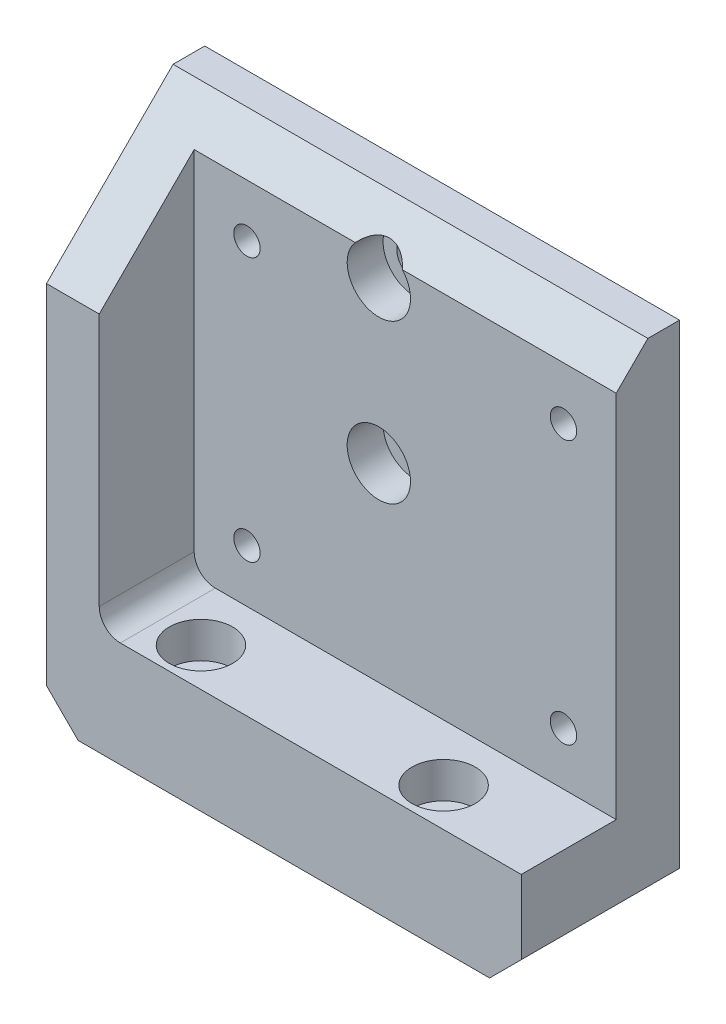
ISO-10303-21;
HEADER;
FILE_DESCRIPTION(('STEP AP214'),'2;1');
FILE_NAME('part.step','',(''),(''),'','','');
FILE_SCHEMA(('AUTOMOTIVE_DESIGN { 1 0 10303 214 1 1 1 1 }'));
ENDSEC;
DATA;
#1=APPLICATION_CONTEXT('core data for automotive mechanical design processes');
#2=APPLICATION_PROTOCOL_DEFINITION('international standard','automotive_design',2000,#1);
#3=PRODUCT_CONTEXT('',#1,'mechanical');
#4=PRODUCT('Part','Part','',(#3));
#5=PRODUCT_RELATED_PRODUCT_CATEGORY('part','',(#4));
#6=PRODUCT_DEFINITION_FORMATION('','',#4);
#7=PRODUCT_DEFINITION_CONTEXT('part definition',#1,'design');
#8=PRODUCT_DEFINITION('design','',#6,#7);
#9=PRODUCT_DEFINITION_SHAPE('','',#8);
#10=(LENGTH_UNIT() NAMED_UNIT(*) SI_UNIT(.MILLI.,.METRE.));
#11=(NAMED_UNIT(*) PLANE_ANGLE_UNIT() SI_UNIT($,.RADIAN.));
#12=(NAMED_UNIT(*) SI_UNIT($,.STERADIAN.) SOLID_ANGLE_UNIT());
#13=UNCERTAINTY_MEASURE_WITH_UNIT(LENGTH_MEASURE(1.E-05),#10,'distance_accuracy_value','');
#14=(GEOMETRIC_REPRESENTATION_CONTEXT(3) GLOBAL_UNCERTAINTY_ASSIGNED_CONTEXT((#13)) GLOBAL_UNIT_ASSIGNED_CONTEXT((#10,
#11,#12)) REPRESENTATION_CONTEXT('',''));
#15=CARTESIAN_POINT('',(0.,0.,0.));
#16=DIRECTION('',(0.,0.,1.));
#17=DIRECTION('',(1.,0.,0.));
#18=AXIS2_PLACEMENT_3D('',#15,#16,#17);
#19=CARTESIAN_POINT('',(-22.5,24.,6.));
#20=DIRECTION('',(0.,-1.,0.));
#21=DIRECTION('',(0.,0.,-1.));
#22=AXIS2_PLACEMENT_3D('',#19,#20,#21);
#23=PLANE('',#22);
#24=DIRECTION('',(-1.,0.,0.));
#25=VECTOR('',#24,1.);
#26=CARTESIAN_POINT('',(156.854164094015,24.,3.));
#27=LINE('',#26,#25);
#28=CARTESIAN_POINT('',(22.5,24.,3.));
#29=VERTEX_POINT('',#28);
#30=CARTESIAN_POINT('',(-22.5,24.,3.));
#31=VERTEX_POINT('',#30);
#32=EDGE_CURVE('E190',#29,#31,#27,.T.);
#33=ORIENTED_EDGE('',*,*,#32,.F.);
#34=DIRECTION('',(0.,0.,-1.));
#35=VECTOR('',#34,1.);
#36=CARTESIAN_POINT('',(22.5,24.,6.));
#37=LINE('',#36,#35);
#38=CARTESIAN_POINT('',(22.5,24.,0.));
#39=VERTEX_POINT('',#38);
#40=EDGE_CURVE('E320',#29,#39,#37,.T.);
#41=ORIENTED_EDGE('',*,*,#40,.T.);
#42=DIRECTION('',(-1.,0.,0.));
#43=VECTOR('',#42,1.);
#44=CARTESIAN_POINT('',(-22.5,24.,0.));
#45=LINE('',#44,#43);
#46=CARTESIAN_POINT('',(-22.5,24.,0.));
#47=VERTEX_POINT('',#46);
#48=EDGE_CURVE('E307',#39,#47,#45,.T.);
#49=ORIENTED_EDGE('',*,*,#48,.T.);
#50=DIRECTION('',(0.,0.,-1.));
#51=VECTOR('',#50,1.);
#52=CARTESIAN_POINT('',(-22.5,24.,6.));
#53=LINE('',#52,#51);
#54=EDGE_CURVE('E302',#31,#47,#53,.T.);
#55=ORIENTED_EDGE('',*,*,#54,.F.);
#56=EDGE_LOOP('',(#33,#41,#49,#55));
#57=FACE_BOUND('',#56,.T.);
#58=ADVANCED_FACE('F48',(#57),#23,.F.);
#59=CARTESIAN_POINT('',(22.5,-14.,15.));
#60=DIRECTION('',(0.,0.,1.));
#61=DIRECTION('',(1.,0.,0.));
#62=AXIS2_PLACEMENT_3D('',#59,#60,#61);
#63=PLANE('',#62);
#64=DIRECTION('',(0.,1.,0.));
#65=VECTOR('',#64,1.);
#66=CARTESIAN_POINT('',(-17.5,24.,15.));
#67=LINE('',#66,#65);
#68=CARTESIAN_POINT('',(-17.5,-12.,15.));
#69=VERTEX_POINT('',#68);
#70=CARTESIAN_POINT('',(-17.5,12.0000000000001,15.));
#71=VERTEX_POINT('',#70);
#72=EDGE_CURVE('E247',#69,#71,#67,.T.);
#73=ORIENTED_EDGE('',*,*,#72,.T.);
#74=DIRECTION('',(-1.,0.,0.));
#75=VECTOR('',#74,1.);
#76=CARTESIAN_POINT('',(156.854164094015,12.0000000000001,15.));
#77=LINE('',#76,#75);
#78=CARTESIAN_POINT('',(-22.5,12.0000000000001,15.));
#79=VERTEX_POINT('',#78);
#80=EDGE_CURVE('E191',#71,#79,#77,.T.);
#81=ORIENTED_EDGE('',*,*,#80,.T.);
#82=DIRECTION('',(0.,-1.,0.));
#83=VECTOR('',#82,1.);
#84=CARTESIAN_POINT('',(-22.5,-14.,15.));
#85=LINE('',#84,#83);
#86=CARTESIAN_POINT('',(-22.5,-21.,15.));
#87=VERTEX_POINT('',#86);
#88=EDGE_CURVE('E72',#79,#87,#85,.T.);
#89=ORIENTED_EDGE('',*,*,#88,.T.);
#90=DIRECTION('',(-0.707106781186546,0.707106781186549,0.));
#91=VECTOR('',#90,1.);
#92=CARTESIAN_POINT('',(-3.5000000000001,-40.,15.));
#93=LINE('',#92,#91);
#94=CARTESIAN_POINT('',(-19.5,-24.,15.));
#95=VERTEX_POINT('',#94);
#96=EDGE_CURVE('E359',#87,#95,#93,.F.);
#97=ORIENTED_EDGE('',*,*,#96,.T.);
#98=DIRECTION('',(-1.,0.,0.));
#99=VECTOR('',#98,1.);
#100=CARTESIAN_POINT('',(22.5,-24.,15.));
#101=LINE('',#100,#99);
#102=CARTESIAN_POINT('',(19.5,-24.,15.));
#103=VERTEX_POINT('',#102);
#104=EDGE_CURVE('E281',#103,#95,#101,.T.);
#105=ORIENTED_EDGE('',*,*,#104,.F.);
#106=DIRECTION('',(-0.707106781186548,-0.707106781186547,0.));
#107=VECTOR('',#106,1.);
#108=CARTESIAN_POINT('',(26.,-17.5,15.));
#109=LINE('',#108,#107);
#110=CARTESIAN_POINT('',(22.5,-21.,15.));
#111=VERTEX_POINT('',#110);
#112=EDGE_CURVE('E362',#103,#111,#109,.F.);
#113=ORIENTED_EDGE('',*,*,#112,.T.);
#114=DIRECTION('',(0.,-1.,0.));
#115=VECTOR('',#114,1.);
#116=CARTESIAN_POINT('',(22.5,-14.,15.));
#117=LINE('',#116,#115);
#118=CARTESIAN_POINT('',(22.5,-14.,15.));
#119=VERTEX_POINT('',#118);
#120=EDGE_CURVE('E285',#119,#111,#117,.T.);
#121=ORIENTED_EDGE('',*,*,#120,.F.);
#122=DIRECTION('',(-1.,0.,0.));
#123=VECTOR('',#122,1.);
#124=CARTESIAN_POINT('',(22.5,-14.,15.));
#125=LINE('',#124,#123);
#126=CARTESIAN_POINT('',(-15.5,-14.,15.));
#127=VERTEX_POINT('',#126);
#128=EDGE_CURVE('E280',#119,#127,#125,.T.);
#129=ORIENTED_EDGE('',*,*,#128,.T.);
#130=CARTESIAN_POINT('',(-15.5,-12.,15.));
#131=DIRECTION('',(0.,0.,1.));
#132=DIRECTION('',(1.,0.,0.));
#133=AXIS2_PLACEMENT_3D('',#130,#131,#132);
#134=CIRCLE('',#133,2.);
#135=EDGE_CURVE('E339',#127,#69,#134,.F.);
#136=ORIENTED_EDGE('',*,*,#135,.T.);
#137=EDGE_LOOP('',(#73,#81,#89,#97,#105,#113,#121,#129,#136));
#138=FACE_BOUND('',#137,.T.);
#139=ADVANCED_FACE('F373',(#138),#63,.T.);
#140=CARTESIAN_POINT('',(0.,0.,6.));
#141=DIRECTION('',(0.,0.,1.));
#142=DIRECTION('',(1.,0.,0.));
#143=AXIS2_PLACEMENT_3D('',#140,#141,#142);
#144=PLANE('',#143);
#145=CARTESIAN_POINT('',(-12.5,16.,6.));
#146=DIRECTION('',(0.,0.,1.));
#147=DIRECTION('',(1.,0.,0.));
#148=AXIS2_PLACEMENT_3D('',#145,#146,#147);
#149=CIRCLE('',#148,1.25);
#150=CARTESIAN_POINT('',(-11.25,16.,6.));
#151=VERTEX_POINT('',#150);
#152=EDGE_CURVE('E161',#151,#151,#149,.T.);
#153=ORIENTED_EDGE('',*,*,#152,.F.);
#154=EDGE_LOOP('',(#153));
#155=FACE_BOUND('',#154,.T.);
#156=CARTESIAN_POINT('',(17.5,16.,6.));
#157=DIRECTION('',(0.,0.,1.));
#158=DIRECTION('',(1.,0.,0.));
#159=AXIS2_PLACEMENT_3D('',#156,#157,#158);
#160=CIRCLE('',#159,1.25);
#161=CARTESIAN_POINT('',(18.75,16.,6.));
#162=VERTEX_POINT('',#161);
#163=EDGE_CURVE('E160',#162,#162,#160,.T.);
#164=ORIENTED_EDGE('',*,*,#163,.F.);
#165=EDGE_LOOP('',(#164));
#166=FACE_BOUND('',#165,.T.);
#167=CARTESIAN_POINT('',(-12.5,-9.,6.));
#168=DIRECTION('',(0.,0.,1.));
#169=DIRECTION('',(1.,0.,0.));
#170=AXIS2_PLACEMENT_3D('',#167,#168,#169);
#171=CIRCLE('',#170,1.25);
#172=CARTESIAN_POINT('',(-11.25,-9.,6.));
#173=VERTEX_POINT('',#172);
#174=EDGE_CURVE('E174',#173,#173,#171,.T.);
#175=ORIENTED_EDGE('',*,*,#174,.F.);
#176=EDGE_LOOP('',(#175));
#177=FACE_BOUND('',#176,.T.);
#178=CARTESIAN_POINT('',(17.5,-9.,6.));
#179=DIRECTION('',(0.,0.,1.));
#180=DIRECTION('',(1.,0.,0.));
#181=AXIS2_PLACEMENT_3D('',#178,#179,#180);
#182=CIRCLE('',#181,1.25);
#183=CARTESIAN_POINT('',(18.75,-9.,6.));
#184=VERTEX_POINT('',#183);
#185=EDGE_CURVE('E182',#184,#184,#182,.T.);
#186=ORIENTED_EDGE('',*,*,#185,.F.);
#187=EDGE_LOOP('',(#186));
#188=FACE_BOUND('',#187,.T.);
#189=DIRECTION('',(1.,0.,0.));
#190=VECTOR('',#189,1.);
#191=CARTESIAN_POINT('',(0.,21.,6.));
#192=LINE('',#191,#190);
#193=CARTESIAN_POINT('',(-17.5,21.,6.));
#194=VERTEX_POINT('',#193);
#195=CARTESIAN_POINT('',(-2.23606797749977,21.,6.));
#196=VERTEX_POINT('',#195);
#197=EDGE_CURVE('E65',#194,#196,#192,.T.);
#198=ORIENTED_EDGE('',*,*,#197,.F.);
#199=DIRECTION('',(0.,1.,0.));
#200=VECTOR('',#199,1.);
#201=CARTESIAN_POINT('',(-17.5,24.,6.));
#202=LINE('',#201,#200);
#203=CARTESIAN_POINT('',(-17.5,-12.,6.));
#204=VERTEX_POINT('',#203);
#205=EDGE_CURVE('E243',#204,#194,#202,.T.);
#206=ORIENTED_EDGE('',*,*,#205,.F.);
#207=CARTESIAN_POINT('',(-15.5,-12.,6.));
#208=DIRECTION('',(0.,0.,1.));
#209=DIRECTION('',(1.,0.,0.));
#210=AXIS2_PLACEMENT_3D('',#207,#208,#209);
#211=CIRCLE('',#210,2.);
#212=CARTESIAN_POINT('',(-15.5,-14.,6.));
#213=VERTEX_POINT('',#212);
#214=EDGE_CURVE('E333',#204,#213,#211,.T.);
#215=ORIENTED_EDGE('',*,*,#214,.T.);
#216=DIRECTION('',(1.,0.,0.));
#217=VECTOR('',#216,1.);
#218=CARTESIAN_POINT('',(0.,-14.,6.));
#219=LINE('',#218,#217);
#220=CARTESIAN_POINT('',(22.5,-14.,6.));
#221=VERTEX_POINT('',#220);
#222=EDGE_CURVE('E291',#213,#221,#219,.T.);
#223=ORIENTED_EDGE('',*,*,#222,.T.);
#224=DIRECTION('',(0.,1.,0.));
#225=VECTOR('',#224,1.);
#226=CARTESIAN_POINT('',(22.5,24.,6.));
#227=LINE('',#226,#225);
#228=CARTESIAN_POINT('',(22.5,21.,6.));
#229=VERTEX_POINT('',#228);
#230=EDGE_CURVE('E298',#221,#229,#227,.T.);
#231=ORIENTED_EDGE('',*,*,#230,.T.);
#232=CARTESIAN_POINT('',(2.23606797749976,21.,6.));
#233=VERTEX_POINT('',#232);
#234=EDGE_CURVE('E194',#233,#229,#192,.T.);
#235=ORIENTED_EDGE('',*,*,#234,.F.);
#236=CARTESIAN_POINT('',(0.,19.,6.));
#237=DIRECTION('',(0.,0.,1.));
#238=DIRECTION('',(1.,0.,0.));
#239=AXIS2_PLACEMENT_3D('',#236,#237,#238);
#240=CIRCLE('',#239,3.);
#241=EDGE_CURVE('E211',#196,#233,#240,.T.);
#242=ORIENTED_EDGE('',*,*,#241,.F.);
#243=EDGE_LOOP('',(#198,#206,#215,#223,#231,#235,#242));
#244=FACE_BOUND('',#243,.T.);
#245=CARTESIAN_POINT('',(0.,4.,6.));
#246=DIRECTION('',(0.,0.,1.));
#247=DIRECTION('',(1.,0.,0.));
#248=AXIS2_PLACEMENT_3D('',#245,#246,#247);
#249=CIRCLE('',#248,3.);
#250=CARTESIAN_POINT('',(3.,4.,6.));
#251=VERTEX_POINT('',#250);
#252=EDGE_CURVE('E227',#251,#251,#249,.T.);
#253=ORIENTED_EDGE('',*,*,#252,.F.);
#254=EDGE_LOOP('',(#253));
#255=FACE_BOUND('',#254,.T.);
#256=ADVANCED_FACE('F403',(#155,#166,#177,#188,#244,#255),#144,.T.);
#257=CARTESIAN_POINT('',(0.,-14.,0.));
#258=DIRECTION('',(0.,-1.,0.));
#259=DIRECTION('',(0.,0.,-1.));
#260=AXIS2_PLACEMENT_3D('',#257,#258,#259);
#261=PLANE('',#260);
#262=CARTESIAN_POINT('',(11.5,-14.,11.36));
#263=DIRECTION('',(0.,1.,0.));
#264=DIRECTION('',(0.,0.,1.));
#265=AXIS2_PLACEMENT_3D('',#262,#263,#264);
#266=CIRCLE('',#265,3.);
#267=CARTESIAN_POINT('',(11.5,-14.,14.36));
#268=VERTEX_POINT('',#267);
#269=EDGE_CURVE('E264',#268,#268,#266,.T.);
#270=ORIENTED_EDGE('',*,*,#269,.F.);
#271=EDGE_LOOP('',(#270));
#272=FACE_BOUND('',#271,.T.);
#273=CARTESIAN_POINT('',(-11.5,-14.,11.36));
#274=DIRECTION('',(0.,1.,0.));
#275=DIRECTION('',(0.,0.,1.));
#276=AXIS2_PLACEMENT_3D('',#273,#274,#275);
#277=CIRCLE('',#276,3.);
#278=CARTESIAN_POINT('',(-11.5,-14.,14.36));
#279=VERTEX_POINT('',#278);
#280=EDGE_CURVE('E251',#279,#279,#277,.T.);
#281=ORIENTED_EDGE('',*,*,#280,.F.);
#282=EDGE_LOOP('',(#281));
#283=FACE_BOUND('',#282,.T.);
#284=ORIENTED_EDGE('',*,*,#222,.F.);
#285=DIRECTION('',(0.,0.,-1.));
#286=VECTOR('',#285,1.);
#287=CARTESIAN_POINT('',(-15.5,-14.,15.));
#288=LINE('',#287,#286);
#289=EDGE_CURVE('E336',#213,#127,#288,.F.);
#290=ORIENTED_EDGE('',*,*,#289,.T.);
#291=ORIENTED_EDGE('',*,*,#128,.F.);
#292=DIRECTION('',(0.,0.,1.));
#293=VECTOR('',#292,1.);
#294=CARTESIAN_POINT('',(22.5,-14.,0.));
#295=LINE('',#294,#293);
#296=EDGE_CURVE('E277',#221,#119,#295,.T.);
#297=ORIENTED_EDGE('',*,*,#296,.F.);
#298=EDGE_LOOP('',(#284,#290,#291,#297));
#299=FACE_BOUND('',#298,.T.);
#300=ADVANCED_FACE('F392',(#272,#283,#299),#261,.F.);
#301=CARTESIAN_POINT('',(22.5,24.,6.));
#302=DIRECTION('',(-1.,0.,0.));
#303=DIRECTION('',(0.,-1.,0.));
#304=AXIS2_PLACEMENT_3D('',#301,#302,#303);
#305=PLANE('',#304);
#306=ORIENTED_EDGE('',*,*,#40,.F.);
#307=DIRECTION('',(0.,-0.707106781186544,0.707106781186551));
#308=VECTOR('',#307,1.);
#309=CARTESIAN_POINT('',(22.5,22.5,4.50000000000001));
#310=LINE('',#309,#308);
#311=EDGE_CURVE('E203',#29,#229,#310,.T.);
#312=ORIENTED_EDGE('',*,*,#311,.T.);
#313=ORIENTED_EDGE('',*,*,#230,.F.);
#314=ORIENTED_EDGE('',*,*,#296,.T.);
#315=ORIENTED_EDGE('',*,*,#120,.T.);
#316=DIRECTION('',(0.,0.,-1.));
#317=VECTOR('',#316,1.);
#318=CARTESIAN_POINT('',(22.5,-21.,6.));
#319=LINE('',#318,#317);
#320=CARTESIAN_POINT('',(22.5,-21.,0.));
#321=VERTEX_POINT('',#320);
#322=EDGE_CURVE('E342',#111,#321,#319,.T.);
#323=ORIENTED_EDGE('',*,*,#322,.T.);
#324=DIRECTION('',(0.,1.,0.));
#325=VECTOR('',#324,1.);
#326=CARTESIAN_POINT('',(22.5,24.,0.));
#327=LINE('',#326,#325);
#328=EDGE_CURVE('E297',#321,#39,#327,.T.);
#329=ORIENTED_EDGE('',*,*,#328,.T.);
#330=EDGE_LOOP('',(#306,#312,#313,#314,#315,#323,#329));
#331=FACE_BOUND('',#330,.T.);
#332=ADVANCED_FACE('F386',(#331),#305,.F.);
#333=CARTESIAN_POINT('',(-22.5,24.,6.));
#334=DIRECTION('',(1.,0.,0.));
#335=DIRECTION('',(0.,1.,0.));
#336=AXIS2_PLACEMENT_3D('',#333,#334,#335);
#337=PLANE('',#336);
#338=ORIENTED_EDGE('',*,*,#88,.F.);
#339=DIRECTION('',(0.,0.707106781186544,-0.707106781186551));
#340=VECTOR('',#339,1.);
#341=CARTESIAN_POINT('',(-22.5,22.5,4.50000000000001));
#342=LINE('',#341,#340);
#343=EDGE_CURVE('E207',#79,#31,#342,.T.);
#344=ORIENTED_EDGE('',*,*,#343,.T.);
#345=ORIENTED_EDGE('',*,*,#54,.T.);
#346=DIRECTION('',(0.,-1.,0.));
#347=VECTOR('',#346,1.);
#348=CARTESIAN_POINT('',(-22.5,24.,0.));
#349=LINE('',#348,#347);
#350=CARTESIAN_POINT('',(-22.5,-21.,0.));
#351=VERTEX_POINT('',#350);
#352=EDGE_CURVE('E311',#47,#351,#349,.T.);
#353=ORIENTED_EDGE('',*,*,#352,.T.);
#354=DIRECTION('',(0.,0.,1.));
#355=VECTOR('',#354,1.);
#356=CARTESIAN_POINT('',(-22.5,-21.,6.));
#357=LINE('',#356,#355);
#358=EDGE_CURVE('E58',#351,#87,#357,.T.);
#359=ORIENTED_EDGE('',*,*,#358,.T.);
#360=EDGE_LOOP('',(#338,#344,#345,#353,#359));
#361=FACE_BOUND('',#360,.T.);
#362=ADVANCED_FACE('F368',(#361),#337,.F.);
#363=CARTESIAN_POINT('',(-22.5,-24.,6.));
#364=DIRECTION('',(0.,1.,0.));
#365=DIRECTION('',(0.,0.,1.));
#366=AXIS2_PLACEMENT_3D('',#363,#364,#365);
#367=PLANE('',#366);
#368=CARTESIAN_POINT('',(-11.5,-24.,11.36));
#369=DIRECTION('',(0.,1.,0.));
#370=DIRECTION('',(0.,0.,1.));
#371=AXIS2_PLACEMENT_3D('',#368,#369,#370);
#372=CIRCLE('',#371,1.7);
#373=CARTESIAN_POINT('',(-11.5,-24.,13.06));
#374=VERTEX_POINT('',#373);
#375=EDGE_CURVE('E263',#374,#374,#372,.T.);
#376=ORIENTED_EDGE('',*,*,#375,.T.);
#377=EDGE_LOOP('',(#376));
#378=FACE_BOUND('',#377,.T.);
#379=CARTESIAN_POINT('',(11.5,-24.,11.36));
#380=DIRECTION('',(0.,1.,0.));
#381=DIRECTION('',(0.,0.,1.));
#382=AXIS2_PLACEMENT_3D('',#379,#380,#381);
#383=CIRCLE('',#382,1.7);
#384=CARTESIAN_POINT('',(11.5,-24.,13.06));
#385=VERTEX_POINT('',#384);
#386=EDGE_CURVE('E276',#385,#385,#383,.T.);
#387=ORIENTED_EDGE('',*,*,#386,.T.);
#388=EDGE_LOOP('',(#387));
#389=FACE_BOUND('',#388,.T.);
#390=DIRECTION('',(1.,0.,0.));
#391=VECTOR('',#390,1.);
#392=CARTESIAN_POINT('',(-22.5,-24.,0.));
#393=LINE('',#392,#391);
#394=CARTESIAN_POINT('',(-19.5,-24.,0.));
#395=VERTEX_POINT('',#394);
#396=CARTESIAN_POINT('',(19.5,-24.,0.));
#397=VERTEX_POINT('',#396);
#398=EDGE_CURVE('E303',#395,#397,#393,.T.);
#399=ORIENTED_EDGE('',*,*,#398,.T.);
#400=DIRECTION('',(0.,0.,1.));
#401=VECTOR('',#400,1.);
#402=CARTESIAN_POINT('',(19.5,-24.,6.));
#403=LINE('',#402,#401);
#404=EDGE_CURVE('E356',#397,#103,#403,.T.);
#405=ORIENTED_EDGE('',*,*,#404,.T.);
#406=ORIENTED_EDGE('',*,*,#104,.T.);
#407=DIRECTION('',(0.,0.,-1.));
#408=VECTOR('',#407,1.);
#409=CARTESIAN_POINT('',(-19.5,-24.,6.));
#410=LINE('',#409,#408);
#411=EDGE_CURVE('E352',#95,#395,#410,.T.);
#412=ORIENTED_EDGE('',*,*,#411,.T.);
#413=EDGE_LOOP('',(#399,#405,#406,#412));
#414=FACE_BOUND('',#413,.T.);
#415=ADVANCED_FACE('F376',(#378,#389,#414),#367,.F.);
#416=CARTESIAN_POINT('',(0.,0.,0.));
#417=DIRECTION('',(0.,0.,1.));
#418=DIRECTION('',(1.,0.,0.));
#419=AXIS2_PLACEMENT_3D('',#416,#417,#418);
#420=PLANE('',#419);
#421=CARTESIAN_POINT('',(0.,19.,0.));
#422=DIRECTION('',(0.,0.,1.));
#423=DIRECTION('',(1.,0.,0.));
#424=AXIS2_PLACEMENT_3D('',#421,#422,#423);
#425=CIRCLE('',#424,1.7);
#426=CARTESIAN_POINT('',(1.7,19.,0.));
#427=VERTEX_POINT('',#426);
#428=EDGE_CURVE('E223',#427,#427,#425,.T.);
#429=ORIENTED_EDGE('',*,*,#428,.T.);
#430=EDGE_LOOP('',(#429));
#431=FACE_BOUND('',#430,.T.);
#432=CARTESIAN_POINT('',(0.,4.,0.));
#433=DIRECTION('',(0.,0.,1.));
#434=DIRECTION('',(1.,0.,0.));
#435=AXIS2_PLACEMENT_3D('',#432,#433,#434);
#436=CIRCLE('',#435,1.7);
#437=CARTESIAN_POINT('',(1.7,4.,0.));
#438=VERTEX_POINT('',#437);
#439=EDGE_CURVE('E239',#438,#438,#436,.T.);
#440=ORIENTED_EDGE('',*,*,#439,.T.);
#441=EDGE_LOOP('',(#440));
#442=FACE_BOUND('',#441,.T.);
#443=ORIENTED_EDGE('',*,*,#328,.F.);
#444=DIRECTION('',(0.707106781186548,0.707106781186547,0.));
#445=VECTOR('',#444,1.);
#446=CARTESIAN_POINT('',(22.5,-21.,0.));
#447=LINE('',#446,#445);
#448=EDGE_CURVE('E349',#321,#397,#447,.F.);
#449=ORIENTED_EDGE('',*,*,#448,.T.);
#450=ORIENTED_EDGE('',*,*,#398,.F.);
#451=DIRECTION('',(0.707106781186546,-0.707106781186549,0.));
#452=VECTOR('',#451,1.);
#453=CARTESIAN_POINT('',(-19.5,-24.,0.));
#454=LINE('',#453,#452);
#455=EDGE_CURVE('E346',#395,#351,#454,.F.);
#456=ORIENTED_EDGE('',*,*,#455,.T.);
#457=ORIENTED_EDGE('',*,*,#352,.F.);
#458=ORIENTED_EDGE('',*,*,#48,.F.);
#459=EDGE_LOOP('',(#443,#449,#450,#456,#457,#458));
#460=FACE_BOUND('',#459,.T.);
#461=ADVANCED_FACE('F416',(#431,#442,#460),#420,.F.);
#462=CARTESIAN_POINT('',(11.5,-14.,11.36));
#463=DIRECTION('',(0.,1.,0.));
#464=DIRECTION('',(0.,0.,1.));
#465=AXIS2_PLACEMENT_3D('',#462,#463,#464);
#466=CYLINDRICAL_SURFACE('',#465,1.7);
#467=CARTESIAN_POINT('',(11.5,-17.4,11.36));
#468=DIRECTION('',(0.,1.,0.));
#469=DIRECTION('',(0.,0.,1.));
#470=AXIS2_PLACEMENT_3D('',#467,#468,#469);
#471=CIRCLE('',#470,1.7);
#472=CARTESIAN_POINT('',(11.5,-17.4,13.06));
#473=VERTEX_POINT('',#472);
#474=EDGE_CURVE('E272',#473,#473,#471,.T.);
#475=ORIENTED_EDGE('',*,*,#474,.T.);
#476=EDGE_LOOP('',(#475));
#477=FACE_BOUND('',#476,.T.);
#478=ORIENTED_EDGE('',*,*,#386,.F.);
#479=EDGE_LOOP('',(#478));
#480=FACE_BOUND('',#479,.T.);
#481=ADVANCED_FACE('F418',(#477,#480),#466,.F.);
#482=CARTESIAN_POINT('',(13.2,-17.4,11.36));
#483=DIRECTION('',(0.,-1.,0.));
#484=DIRECTION('',(0.,0.,-1.));
#485=AXIS2_PLACEMENT_3D('',#482,#483,#484);
#486=PLANE('',#485);
#487=ORIENTED_EDGE('',*,*,#474,.F.);
#488=EDGE_LOOP('',(#487));
#489=FACE_BOUND('',#488,.T.);
#490=CARTESIAN_POINT('',(11.5,-17.4,11.36));
#491=DIRECTION('',(0.,1.,0.));
#492=DIRECTION('',(0.,0.,1.));
#493=AXIS2_PLACEMENT_3D('',#490,#491,#492);
#494=CIRCLE('',#493,3.);
#495=CARTESIAN_POINT('',(11.5,-17.4,14.36));
#496=VERTEX_POINT('',#495);
#497=EDGE_CURVE('E268',#496,#496,#494,.T.);
#498=ORIENTED_EDGE('',*,*,#497,.T.);
#499=EDGE_LOOP('',(#498));
#500=FACE_BOUND('',#499,.T.);
#501=ADVANCED_FACE('F425',(#489,#500),#486,.F.);
#502=CARTESIAN_POINT('',(11.5,-14.,11.36));
#503=DIRECTION('',(0.,1.,0.));
#504=DIRECTION('',(0.,0.,1.));
#505=AXIS2_PLACEMENT_3D('',#502,#503,#504);
#506=CYLINDRICAL_SURFACE('',#505,3.);
#507=ORIENTED_EDGE('',*,*,#497,.F.);
#508=EDGE_LOOP('',(#507));
#509=FACE_BOUND('',#508,.T.);
#510=ORIENTED_EDGE('',*,*,#269,.T.);
#511=EDGE_LOOP('',(#510));
#512=FACE_BOUND('',#511,.T.);
#513=ADVANCED_FACE('F492',(#509,#512),#506,.F.);
#514=CARTESIAN_POINT('',(-11.5,-14.,11.36));
#515=DIRECTION('',(0.,1.,0.));
#516=DIRECTION('',(0.,0.,1.));
#517=AXIS2_PLACEMENT_3D('',#514,#515,#516);
#518=CYLINDRICAL_SURFACE('',#517,1.7);
#519=CARTESIAN_POINT('',(-11.5,-17.4,11.36));
#520=DIRECTION('',(0.,1.,0.));
#521=DIRECTION('',(0.,0.,1.));
#522=AXIS2_PLACEMENT_3D('',#519,#520,#521);
#523=CIRCLE('',#522,1.7);
#524=CARTESIAN_POINT('',(-11.5,-17.4,13.06));
#525=VERTEX_POINT('',#524);
#526=EDGE_CURVE('E259',#525,#525,#523,.T.);
#527=ORIENTED_EDGE('',*,*,#526,.T.);
#528=EDGE_LOOP('',(#527));
#529=FACE_BOUND('',#528,.T.);
#530=ORIENTED_EDGE('',*,*,#375,.F.);
#531=EDGE_LOOP('',(#530));
#532=FACE_BOUND('',#531,.T.);
#533=ADVANCED_FACE('F488',(#529,#532),#518,.F.);
#534=CARTESIAN_POINT('',(-9.8,-17.4,11.36));
#535=DIRECTION('',(0.,-1.,0.));
#536=DIRECTION('',(0.,0.,-1.));
#537=AXIS2_PLACEMENT_3D('',#534,#535,#536);
#538=PLANE('',#537);
#539=ORIENTED_EDGE('',*,*,#526,.F.);
#540=EDGE_LOOP('',(#539));
#541=FACE_BOUND('',#540,.T.);
#542=CARTESIAN_POINT('',(-11.5,-17.4,11.36));
#543=DIRECTION('',(0.,1.,0.));
#544=DIRECTION('',(0.,0.,1.));
#545=AXIS2_PLACEMENT_3D('',#542,#543,#544);
#546=CIRCLE('',#545,3.);
#547=CARTESIAN_POINT('',(-11.5,-17.4,14.36));
#548=VERTEX_POINT('',#547);
#549=EDGE_CURVE('E255',#548,#548,#546,.T.);
#550=ORIENTED_EDGE('',*,*,#549,.T.);
#551=EDGE_LOOP('',(#550));
#552=FACE_BOUND('',#551,.T.);
#553=ADVANCED_FACE('F484',(#541,#552),#538,.F.);
#554=CARTESIAN_POINT('',(-11.5,-14.,11.36));
#555=DIRECTION('',(0.,1.,0.));
#556=DIRECTION('',(0.,0.,1.));
#557=AXIS2_PLACEMENT_3D('',#554,#555,#556);
#558=CYLINDRICAL_SURFACE('',#557,3.);
#559=ORIENTED_EDGE('',*,*,#549,.F.);
#560=EDGE_LOOP('',(#559));
#561=FACE_BOUND('',#560,.T.);
#562=ORIENTED_EDGE('',*,*,#280,.T.);
#563=EDGE_LOOP('',(#562));
#564=FACE_BOUND('',#563,.T.);
#565=ADVANCED_FACE('F481',(#561,#564),#558,.F.);
#566=CARTESIAN_POINT('',(-17.5,24.,53.3275357934736));
#567=DIRECTION('',(-1.,0.,0.));
#568=DIRECTION('',(0.,-1.,0.));
#569=AXIS2_PLACEMENT_3D('',#566,#567,#568);
#570=PLANE('',#569);
#571=ORIENTED_EDGE('',*,*,#205,.T.);
#572=DIRECTION('',(0.,-0.707106781186544,0.707106781186551));
#573=VECTOR('',#572,1.);
#574=CARTESIAN_POINT('',(-17.5,-1.1637678967368,28.1637678967371));
#575=LINE('',#574,#573);
#576=EDGE_CURVE('E199',#194,#71,#575,.T.);
#577=ORIENTED_EDGE('',*,*,#576,.T.);
#578=ORIENTED_EDGE('',*,*,#72,.F.);
#579=DIRECTION('',(0.,0.,-1.));
#580=VECTOR('',#579,1.);
#581=CARTESIAN_POINT('',(-17.5,-12.,6.));
#582=LINE('',#581,#580);
#583=EDGE_CURVE('E323',#69,#204,#582,.T.);
#584=ORIENTED_EDGE('',*,*,#583,.T.);
#585=EDGE_LOOP('',(#571,#577,#578,#584));
#586=FACE_BOUND('',#585,.T.);
#587=ADVANCED_FACE('F401',(#586),#570,.F.);
#588=CARTESIAN_POINT('',(-15.5,-12.,53.3275357934736));
#589=DIRECTION('',(0.,0.,1.));
#590=DIRECTION('',(1.,0.,0.));
#591=AXIS2_PLACEMENT_3D('',#588,#589,#590);
#592=CYLINDRICAL_SURFACE('',#591,2.);
#593=ORIENTED_EDGE('',*,*,#135,.F.);
#594=ORIENTED_EDGE('',*,*,#289,.F.);
#595=ORIENTED_EDGE('',*,*,#214,.F.);
#596=ORIENTED_EDGE('',*,*,#583,.F.);
#597=EDGE_LOOP('',(#593,#594,#595,#596));
#598=FACE_BOUND('',#597,.T.);
#599=ADVANCED_FACE('F398',(#598),#592,.F.);
#600=CARTESIAN_POINT('',(0.,4.,6.));
#601=DIRECTION('',(0.,0.,1.));
#602=DIRECTION('',(1.,0.,0.));
#603=AXIS2_PLACEMENT_3D('',#600,#601,#602);
#604=CYLINDRICAL_SURFACE('',#603,1.7);
#605=ORIENTED_EDGE('',*,*,#439,.F.);
#606=EDGE_LOOP('',(#605));
#607=FACE_BOUND('',#606,.T.);
#608=CARTESIAN_POINT('',(0.,4.,2.6));
#609=DIRECTION('',(0.,0.,1.));
#610=DIRECTION('',(1.,0.,0.));
#611=AXIS2_PLACEMENT_3D('',#608,#609,#610);
#612=CIRCLE('',#611,1.7);
#613=CARTESIAN_POINT('',(1.7,4.,2.6));
#614=VERTEX_POINT('',#613);
#615=EDGE_CURVE('E235',#614,#614,#612,.T.);
#616=ORIENTED_EDGE('',*,*,#615,.T.);
#617=EDGE_LOOP('',(#616));
#618=FACE_BOUND('',#617,.T.);
#619=ADVANCED_FACE('F443',(#607,#618),#604,.F.);
#620=CARTESIAN_POINT('',(1.7,4.,2.6));
#621=DIRECTION('',(0.,0.,-1.));
#622=DIRECTION('',(-1.,0.,0.));
#623=AXIS2_PLACEMENT_3D('',#620,#621,#622);
#624=PLANE('',#623);
#625=ORIENTED_EDGE('',*,*,#615,.F.);
#626=EDGE_LOOP('',(#625));
#627=FACE_BOUND('',#626,.T.);
#628=CARTESIAN_POINT('',(0.,4.,2.6));
#629=DIRECTION('',(0.,0.,1.));
#630=DIRECTION('',(1.,0.,0.));
#631=AXIS2_PLACEMENT_3D('',#628,#629,#630);
#632=CIRCLE('',#631,3.);
#633=CARTESIAN_POINT('',(3.,4.,2.6));
#634=VERTEX_POINT('',#633);
#635=EDGE_CURVE('E231',#634,#634,#632,.T.);
#636=ORIENTED_EDGE('',*,*,#635,.T.);
#637=EDGE_LOOP('',(#636));
#638=FACE_BOUND('',#637,.T.);
#639=ADVANCED_FACE('F471',(#627,#638),#624,.F.);
#640=CARTESIAN_POINT('',(0.,4.,6.));
#641=DIRECTION('',(0.,0.,1.));
#642=DIRECTION('',(1.,0.,0.));
#643=AXIS2_PLACEMENT_3D('',#640,#641,#642);
#644=CYLINDRICAL_SURFACE('',#643,3.);
#645=ORIENTED_EDGE('',*,*,#635,.F.);
#646=EDGE_LOOP('',(#645));
#647=FACE_BOUND('',#646,.T.);
#648=ORIENTED_EDGE('',*,*,#252,.T.);
#649=EDGE_LOOP('',(#648));
#650=FACE_BOUND('',#649,.T.);
#651=ADVANCED_FACE('F467',(#647,#650),#644,.F.);
#652=CARTESIAN_POINT('',(0.,19.,6.));
#653=DIRECTION('',(0.,0.,1.));
#654=DIRECTION('',(1.,0.,0.));
#655=AXIS2_PLACEMENT_3D('',#652,#653,#654);
#656=CYLINDRICAL_SURFACE('',#655,1.7);
#657=ORIENTED_EDGE('',*,*,#428,.F.);
#658=EDGE_LOOP('',(#657));
#659=FACE_BOUND('',#658,.T.);
#660=CARTESIAN_POINT('',(0.,19.,2.6));
#661=DIRECTION('',(0.,0.,1.));
#662=DIRECTION('',(1.,0.,0.));
#663=AXIS2_PLACEMENT_3D('',#660,#661,#662);
#664=CIRCLE('',#663,1.7);
#665=CARTESIAN_POINT('',(1.7,19.,2.6));
#666=VERTEX_POINT('',#665);
#667=EDGE_CURVE('E219',#666,#666,#664,.T.);
#668=ORIENTED_EDGE('',*,*,#667,.T.);
#669=EDGE_LOOP('',(#668));
#670=FACE_BOUND('',#669,.T.);
#671=ADVANCED_FACE('F458',(#659,#670),#656,.F.);
#672=CARTESIAN_POINT('',(1.7,19.,2.6));
#673=DIRECTION('',(0.,0.,-1.));
#674=DIRECTION('',(-1.,0.,0.));
#675=AXIS2_PLACEMENT_3D('',#672,#673,#674);
#676=PLANE('',#675);
#677=ORIENTED_EDGE('',*,*,#667,.F.);
#678=EDGE_LOOP('',(#677));
#679=FACE_BOUND('',#678,.T.);
#680=CARTESIAN_POINT('',(0.,19.,2.6));
#681=DIRECTION('',(0.,0.,1.));
#682=DIRECTION('',(1.,0.,0.));
#683=AXIS2_PLACEMENT_3D('',#680,#681,#682);
#684=CIRCLE('',#683,3.);
#685=CARTESIAN_POINT('',(3.,19.,2.6));
#686=VERTEX_POINT('',#685);
#687=EDGE_CURVE('E215',#686,#686,#684,.T.);
#688=ORIENTED_EDGE('',*,*,#687,.T.);
#689=EDGE_LOOP('',(#688));
#690=FACE_BOUND('',#689,.T.);
#691=ADVANCED_FACE('F452',(#679,#690),#676,.F.);
#692=CARTESIAN_POINT('',(0.,19.,6.));
#693=DIRECTION('',(0.,0.,1.));
#694=DIRECTION('',(1.,0.,0.));
#695=AXIS2_PLACEMENT_3D('',#692,#693,#694);
#696=CYLINDRICAL_SURFACE('',#695,3.);
#697=ORIENTED_EDGE('',*,*,#687,.F.);
#698=EDGE_LOOP('',(#697));
#699=FACE_BOUND('',#698,.T.);
#700=ORIENTED_EDGE('',*,*,#241,.T.);
#701=CARTESIAN_POINT('',(0.,19.,8.00000000000005));
#702=DIRECTION('',(0.,-0.707106781186551,-0.707106781186544));
#703=DIRECTION('',(0.,-0.707106781186544,0.707106781186551));
#704=AXIS2_PLACEMENT_3D('',#701,#702,#703);
#705=ELLIPSE('',#704,4.24264068711931,3.);
#706=EDGE_CURVE('E11',#233,#196,#705,.F.);
#707=ORIENTED_EDGE('',*,*,#706,.T.);
#708=EDGE_LOOP('',(#700,#707));
#709=FACE_BOUND('',#708,.T.);
#710=ADVANCED_FACE('F409',(#699,#709),#696,.F.);
#711=CARTESIAN_POINT('',(22.5,-21.,6.));
#712=DIRECTION('',(-0.707106781186547,0.707106781186548,0.));
#713=DIRECTION('',(0.,0.,-1.));
#714=AXIS2_PLACEMENT_3D('',#711,#712,#713);
#715=PLANE('',#714);
#716=ORIENTED_EDGE('',*,*,#112,.F.);
#717=ORIENTED_EDGE('',*,*,#404,.F.);
#718=ORIENTED_EDGE('',*,*,#448,.F.);
#719=ORIENTED_EDGE('',*,*,#322,.F.);
#720=EDGE_LOOP('',(#716,#717,#718,#719));
#721=FACE_BOUND('',#720,.T.);
#722=ADVANCED_FACE('F380',(#721),#715,.F.);
#723=CARTESIAN_POINT('',(-19.5,-24.,6.));
#724=DIRECTION('',(0.707106781186549,0.707106781186546,0.));
#725=DIRECTION('',(0.,0.,-1.));
#726=AXIS2_PLACEMENT_3D('',#723,#724,#725);
#727=PLANE('',#726);
#728=ORIENTED_EDGE('',*,*,#96,.F.);
#729=ORIENTED_EDGE('',*,*,#358,.F.);
#730=ORIENTED_EDGE('',*,*,#455,.F.);
#731=ORIENTED_EDGE('',*,*,#411,.F.);
#732=EDGE_LOOP('',(#728,#729,#730,#731));
#733=FACE_BOUND('',#732,.T.);
#734=ADVANCED_FACE('F51',(#733),#727,.F.);
#735=CARTESIAN_POINT('',(156.854164094015,24.,3.));
#736=DIRECTION('',(0.,-0.707106781186551,-0.707106781186544));
#737=DIRECTION('',(0.,0.707106781186544,-0.707106781186551));
#738=AXIS2_PLACEMENT_3D('',#735,#736,#737);
#739=PLANE('',#738);
#740=ORIENTED_EDGE('',*,*,#343,.F.);
#741=ORIENTED_EDGE('',*,*,#80,.F.);
#742=ORIENTED_EDGE('',*,*,#576,.F.);
#743=ORIENTED_EDGE('',*,*,#197,.T.);
#744=ORIENTED_EDGE('',*,*,#706,.F.);
#745=ORIENTED_EDGE('',*,*,#234,.T.);
#746=ORIENTED_EDGE('',*,*,#311,.F.);
#747=ORIENTED_EDGE('',*,*,#32,.T.);
#748=EDGE_LOOP('',(#740,#741,#742,#743,#744,#745,#746,#747));
#749=FACE_BOUND('',#748,.T.);
#750=ADVANCED_FACE('F410',(#749),#739,.F.);
#751=CARTESIAN_POINT('',(17.5,-9.,2.));
#752=DIRECTION('',(0.,0.,1.));
#753=DIRECTION('',(1.,0.,0.));
#754=AXIS2_PLACEMENT_3D('',#751,#752,#753);
#755=CONICAL_SURFACE('',#754,1.25,1.02974425867665);
#756=CARTESIAN_POINT('',(17.5,-9.,1.24892422621555));
#757=VERTEX_POINT('',#756);
#758=VERTEX_LOOP('',#757);
#759=FACE_BOUND('',#758,.T.);
#760=CARTESIAN_POINT('',(17.5,-9.,2.));
#761=DIRECTION('',(0.,0.,1.));
#762=DIRECTION('',(1.,0.,0.));
#763=AXIS2_PLACEMENT_3D('',#760,#761,#762);
#764=CIRCLE('',#763,1.25);
#765=CARTESIAN_POINT('',(18.75,-9.,2.));
#766=VERTEX_POINT('',#765);
#767=EDGE_CURVE('E186',#766,#766,#764,.T.);
#768=ORIENTED_EDGE('',*,*,#767,.T.);
#769=EDGE_LOOP('',(#768));
#770=FACE_BOUND('',#769,.T.);
#771=ADVANCED_FACE('F517',(#759,#770),#755,.F.);
#772=CARTESIAN_POINT('',(17.5,-9.,6.));
#773=DIRECTION('',(0.,0.,1.));
#774=DIRECTION('',(1.,0.,0.));
#775=AXIS2_PLACEMENT_3D('',#772,#773,#774);
#776=CYLINDRICAL_SURFACE('',#775,1.25);
#777=ORIENTED_EDGE('',*,*,#767,.F.);
#778=EDGE_LOOP('',(#777));
#779=FACE_BOUND('',#778,.T.);
#780=ORIENTED_EDGE('',*,*,#185,.T.);
#781=EDGE_LOOP('',(#780));
#782=FACE_BOUND('',#781,.T.);
#783=ADVANCED_FACE('F514',(#779,#782),#776,.F.);
#784=CARTESIAN_POINT('',(-12.5,-9.,2.));
#785=DIRECTION('',(0.,0.,1.));
#786=DIRECTION('',(1.,0.,0.));
#787=AXIS2_PLACEMENT_3D('',#784,#785,#786);
#788=CONICAL_SURFACE('',#787,1.25,1.02974425867665);
#789=CARTESIAN_POINT('',(-12.5,-9.,1.24892422621555));
#790=VERTEX_POINT('',#789);
#791=VERTEX_LOOP('',#790);
#792=FACE_BOUND('',#791,.T.);
#793=CARTESIAN_POINT('',(-12.5,-9.,2.));
#794=DIRECTION('',(0.,0.,1.));
#795=DIRECTION('',(1.,0.,0.));
#796=AXIS2_PLACEMENT_3D('',#793,#794,#795);
#797=CIRCLE('',#796,1.25);
#798=CARTESIAN_POINT('',(-11.25,-9.,2.));
#799=VERTEX_POINT('',#798);
#800=EDGE_CURVE('E178',#799,#799,#797,.T.);
#801=ORIENTED_EDGE('',*,*,#800,.T.);
#802=EDGE_LOOP('',(#801));
#803=FACE_BOUND('',#802,.T.);
#804=ADVANCED_FACE('F516',(#792,#803),#788,.F.);
#805=CARTESIAN_POINT('',(-12.5,-9.,6.));
#806=DIRECTION('',(0.,0.,1.));
#807=DIRECTION('',(1.,0.,0.));
#808=AXIS2_PLACEMENT_3D('',#805,#806,#807);
#809=CYLINDRICAL_SURFACE('',#808,1.25);
#810=ORIENTED_EDGE('',*,*,#800,.F.);
#811=EDGE_LOOP('',(#810));
#812=FACE_BOUND('',#811,.T.);
#813=ORIENTED_EDGE('',*,*,#174,.T.);
#814=EDGE_LOOP('',(#813));
#815=FACE_BOUND('',#814,.T.);
#816=ADVANCED_FACE('F524',(#812,#815),#809,.F.);
#817=CARTESIAN_POINT('',(17.5,16.,2.));
#818=DIRECTION('',(0.,0.,1.));
#819=DIRECTION('',(1.,0.,0.));
#820=AXIS2_PLACEMENT_3D('',#817,#818,#819);
#821=CONICAL_SURFACE('',#820,1.25,1.02974425867665);
#822=CARTESIAN_POINT('',(17.5,16.,1.24892422621555));
#823=VERTEX_POINT('',#822);
#824=VERTEX_LOOP('',#823);
#825=FACE_BOUND('',#824,.T.);
#826=CARTESIAN_POINT('',(17.5,16.,2.));
#827=DIRECTION('',(0.,0.,1.));
#828=DIRECTION('',(1.,0.,0.));
#829=AXIS2_PLACEMENT_3D('',#826,#827,#828);
#830=CIRCLE('',#829,1.25);
#831=CARTESIAN_POINT('',(18.75,16.,2.));
#832=VERTEX_POINT('',#831);
#833=EDGE_CURVE('E166',#832,#832,#830,.T.);
#834=ORIENTED_EDGE('',*,*,#833,.T.);
#835=EDGE_LOOP('',(#834));
#836=FACE_BOUND('',#835,.T.);
#837=ADVANCED_FACE('F532',(#825,#836),#821,.F.);
#838=CARTESIAN_POINT('',(17.5,16.,6.));
#839=DIRECTION('',(0.,0.,1.));
#840=DIRECTION('',(1.,0.,0.));
#841=AXIS2_PLACEMENT_3D('',#838,#839,#840);
#842=CYLINDRICAL_SURFACE('',#841,1.25);
#843=ORIENTED_EDGE('',*,*,#833,.F.);
#844=EDGE_LOOP('',(#843));
#845=FACE_BOUND('',#844,.T.);
#846=ORIENTED_EDGE('',*,*,#163,.T.);
#847=EDGE_LOOP('',(#846));
#848=FACE_BOUND('',#847,.T.);
#849=ADVANCED_FACE('F153',(#845,#848),#842,.F.);
#850=CARTESIAN_POINT('',(-12.5,16.,2.));
#851=DIRECTION('',(0.,0.,1.));
#852=DIRECTION('',(1.,0.,0.));
#853=AXIS2_PLACEMENT_3D('',#850,#851,#852);
#854=CONICAL_SURFACE('',#853,1.25,1.02974425867665);
#855=CARTESIAN_POINT('',(-12.5,16.,1.24892422621555));
#856=VERTEX_POINT('',#855);
#857=VERTEX_LOOP('',#856);
#858=FACE_BOUND('',#857,.T.);
#859=CARTESIAN_POINT('',(-12.5,16.,2.));
#860=DIRECTION('',(0.,0.,1.));
#861=DIRECTION('',(1.,0.,0.));
#862=AXIS2_PLACEMENT_3D('',#859,#860,#861);
#863=CIRCLE('',#862,1.25);
#864=CARTESIAN_POINT('',(-11.25,16.,2.));
#865=VERTEX_POINT('',#864);
#866=EDGE_CURVE('E157',#865,#865,#863,.T.);
#867=ORIENTED_EDGE('',*,*,#866,.T.);
#868=EDGE_LOOP('',(#867));
#869=FACE_BOUND('',#868,.T.);
#870=ADVANCED_FACE('F149',(#858,#869),#854,.F.);
#871=CARTESIAN_POINT('',(-12.5,16.,6.));
#872=DIRECTION('',(0.,0.,1.));
#873=DIRECTION('',(1.,0.,0.));
#874=AXIS2_PLACEMENT_3D('',#871,#872,#873);
#875=CYLINDRICAL_SURFACE('',#874,1.25);
#876=ORIENTED_EDGE('',*,*,#866,.F.);
#877=EDGE_LOOP('',(#876));
#878=FACE_BOUND('',#877,.T.);
#879=ORIENTED_EDGE('',*,*,#152,.T.);
#880=EDGE_LOOP('',(#879));
#881=FACE_BOUND('',#880,.T.);
#882=ADVANCED_FACE('F152',(#878,#881),#875,.F.);
#883=CLOSED_SHELL('',(#58,#139,#256,#300,#332,#362,#415,#461,#481,#501,#513,#533,#553,#565,#587,
#599,#619,#639,#651,#671,#691,#710,#722,#734,#750,#771,#783,#804,#816,#837,#849,#870,#882));
#884=MANIFOLD_SOLID_BREP('B2',#883);
#885=ADVANCED_BREP_SHAPE_REPRESENTATION('',(#18,#884),#14);
#886=SHAPE_DEFINITION_REPRESENTATION(#9,#885);
ENDSEC;
END-ISO-10303-21;
